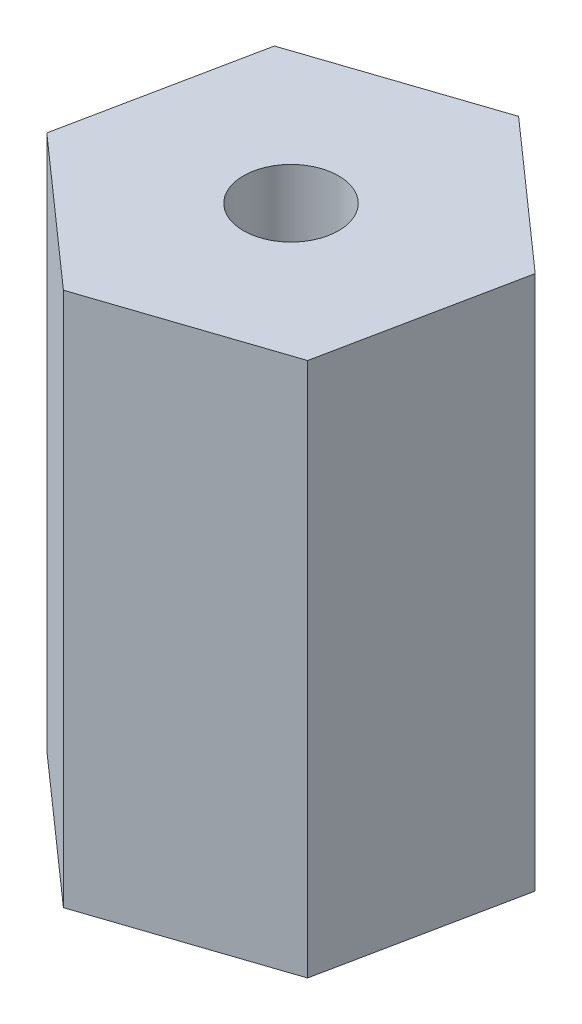
ISO-10303-21;
HEADER;
FILE_DESCRIPTION(('STEP AP214'),'2;1');
FILE_NAME('part.step','',(''),(''),'','','');
FILE_SCHEMA(('AUTOMOTIVE_DESIGN { 1 0 10303 214 1 1 1 1 }'));
ENDSEC;
DATA;
#1=APPLICATION_CONTEXT('core data for automotive mechanical design processes');
#2=APPLICATION_PROTOCOL_DEFINITION('international standard','automotive_design',2000,#1);
#3=PRODUCT_CONTEXT('',#1,'mechanical');
#4=PRODUCT('Part','Part','',(#3));
#5=PRODUCT_RELATED_PRODUCT_CATEGORY('part','',(#4));
#6=PRODUCT_DEFINITION_FORMATION('','',#4);
#7=PRODUCT_DEFINITION_CONTEXT('part definition',#1,'design');
#8=PRODUCT_DEFINITION('design','',#6,#7);
#9=PRODUCT_DEFINITION_SHAPE('','',#8);
#10=(LENGTH_UNIT() NAMED_UNIT(*) SI_UNIT(.MILLI.,.METRE.));
#11=(NAMED_UNIT(*) PLANE_ANGLE_UNIT() SI_UNIT($,.RADIAN.));
#12=(NAMED_UNIT(*) SI_UNIT($,.STERADIAN.) SOLID_ANGLE_UNIT());
#13=UNCERTAINTY_MEASURE_WITH_UNIT(LENGTH_MEASURE(1.E-05),#10,'distance_accuracy_value','');
#14=(GEOMETRIC_REPRESENTATION_CONTEXT(3) GLOBAL_UNCERTAINTY_ASSIGNED_CONTEXT((#13)) GLOBAL_UNIT_ASSIGNED_CONTEXT((#10,
#11,#12)) REPRESENTATION_CONTEXT('',''));
#15=CARTESIAN_POINT('',(0.,0.,0.));
#16=DIRECTION('',(0.,0.,1.));
#17=DIRECTION('',(1.,0.,0.));
#18=AXIS2_PLACEMENT_3D('',#15,#16,#17);
#19=CARTESIAN_POINT('',(-0.914726857565936,12.7,4.49049850900553));
#20=DIRECTION('',(-0.317076598186586,0.,-0.948399931928731));
#21=DIRECTION('',(-0.948399931928732,0.,0.317076598186586));
#22=AXIS2_PLACEMENT_3D('',#19,#20,#21);
#23=PLANE('',#22);
#24=DIRECTION('',(0.948399931928732,0.,-0.317076598186586));
#25=VECTOR('',#24,1.);
#26=CARTESIAN_POINT('',(-0.914726857565936,0.,4.49049850900553));
#27=LINE('',#26,#25);
#28=CARTESIAN_POINT('',(-0.914726857565936,0.,4.49049850900553));
#29=VERTEX_POINT('',#28);
#30=CARTESIAN_POINT('',(3.43152235567196,0.,3.03742595067878));
#31=VERTEX_POINT('',#30);
#32=EDGE_CURVE('E122',#29,#31,#27,.T.);
#33=ORIENTED_EDGE('',*,*,#32,.T.);
#34=DIRECTION('',(0.,-1.,0.));
#35=VECTOR('',#34,1.);
#36=CARTESIAN_POINT('',(3.43152235567196,12.7,3.03742595067878));
#37=LINE('',#36,#35);
#38=CARTESIAN_POINT('',(3.43152235567196,12.7,3.03742595067878));
#39=VERTEX_POINT('',#38);
#40=EDGE_CURVE('E11',#39,#31,#37,.T.);
#41=ORIENTED_EDGE('',*,*,#40,.F.);
#42=DIRECTION('',(0.948399931928732,0.,-0.317076598186586));
#43=VECTOR('',#42,1.);
#44=CARTESIAN_POINT('',(-0.914726857565936,12.7,4.49049850900553));
#45=LINE('',#44,#43);
#46=CARTESIAN_POINT('',(-0.914726857565936,12.7,4.49049850900553));
#47=VERTEX_POINT('',#46);
#48=EDGE_CURVE('E133',#47,#39,#45,.T.);
#49=ORIENTED_EDGE('',*,*,#48,.F.);
#50=DIRECTION('',(0.,-1.,0.));
#51=VECTOR('',#50,1.);
#52=CARTESIAN_POINT('',(-0.914726857565936,12.7,4.49049850900553));
#53=LINE('',#52,#51);
#54=EDGE_CURVE('E118',#47,#29,#53,.T.);
#55=ORIENTED_EDGE('',*,*,#54,.T.);
#56=EDGE_LOOP('',(#33,#41,#49,#55));
#57=FACE_BOUND('',#56,.T.);
#58=ADVANCED_FACE('F35',(#57),#23,.F.);
#59=CARTESIAN_POINT('',(3.43152235567196,12.7,3.03742595067878));
#60=DIRECTION('',(-0.979876733091007,0.,-0.199603576989231));
#61=DIRECTION('',(-0.199603576989231,0.,0.979876733091007));
#62=AXIS2_PLACEMENT_3D('',#59,#60,#61);
#63=PLANE('',#62);
#64=DIRECTION('',(0.199603576989231,0.,-0.979876733091007));
#65=VECTOR('',#64,1.);
#66=CARTESIAN_POINT('',(3.43152235567196,0.,3.03742595067878));
#67=LINE('',#66,#65);
#68=CARTESIAN_POINT('',(4.3462492132379,0.,-1.45307255832675));
#69=VERTEX_POINT('',#68);
#70=EDGE_CURVE('E125',#31,#69,#67,.T.);
#71=ORIENTED_EDGE('',*,*,#70,.T.);
#72=DIRECTION('',(0.,-1.,0.));
#73=VECTOR('',#72,1.);
#74=CARTESIAN_POINT('',(4.3462492132379,12.7,-1.45307255832675));
#75=LINE('',#74,#73);
#76=CARTESIAN_POINT('',(4.3462492132379,12.7,-1.45307255832675));
#77=VERTEX_POINT('',#76);
#78=EDGE_CURVE('E43',#77,#69,#75,.T.);
#79=ORIENTED_EDGE('',*,*,#78,.F.);
#80=DIRECTION('',(0.199603576989231,0.,-0.979876733091007));
#81=VECTOR('',#80,1.);
#82=CARTESIAN_POINT('',(3.43152235567196,12.7,3.03742595067878));
#83=LINE('',#82,#81);
#84=EDGE_CURVE('E89',#39,#77,#83,.T.);
#85=ORIENTED_EDGE('',*,*,#84,.F.);
#86=ORIENTED_EDGE('',*,*,#40,.T.);
#87=EDGE_LOOP('',(#71,#79,#85,#86));
#88=FACE_BOUND('',#87,.T.);
#89=ADVANCED_FACE('F158',(#88),#63,.F.);
#90=CARTESIAN_POINT('',(4.3462492132379,12.7,-1.45307255832675));
#91=DIRECTION('',(-0.662800134904421,0.,0.7487963549395));
#92=DIRECTION('',(0.7487963549395,0.,0.662800134904421));
#93=AXIS2_PLACEMENT_3D('',#90,#91,#92);
#94=PLANE('',#93);
#95=DIRECTION('',(-0.7487963549395,0.,-0.662800134904421));
#96=VECTOR('',#95,1.);
#97=CARTESIAN_POINT('',(4.3462492132379,0.,-1.45307255832675));
#98=LINE('',#97,#96);
#99=CARTESIAN_POINT('',(0.914726857565939,0.,-4.49049850900553));
#100=VERTEX_POINT('',#99);
#101=EDGE_CURVE('E128',#69,#100,#98,.T.);
#102=ORIENTED_EDGE('',*,*,#101,.T.);
#103=DIRECTION('',(0.,-1.,0.));
#104=VECTOR('',#103,1.);
#105=CARTESIAN_POINT('',(0.914726857565939,12.7,-4.49049850900553));
#106=LINE('',#105,#104);
#107=CARTESIAN_POINT('',(0.914726857565939,12.7,-4.49049850900553));
#108=VERTEX_POINT('',#107);
#109=EDGE_CURVE('E113',#108,#100,#106,.T.);
#110=ORIENTED_EDGE('',*,*,#109,.F.);
#111=DIRECTION('',(-0.7487963549395,0.,-0.662800134904421));
#112=VECTOR('',#111,1.);
#113=CARTESIAN_POINT('',(4.3462492132379,12.7,-1.45307255832675));
#114=LINE('',#113,#112);
#115=EDGE_CURVE('E104',#77,#108,#114,.T.);
#116=ORIENTED_EDGE('',*,*,#115,.F.);
#117=ORIENTED_EDGE('',*,*,#78,.T.);
#118=EDGE_LOOP('',(#102,#110,#116,#117));
#119=FACE_BOUND('',#118,.T.);
#120=ADVANCED_FACE('F139',(#119),#94,.F.);
#121=CARTESIAN_POINT('',(0.914726857565939,12.7,-4.49049850900553));
#122=DIRECTION('',(0.317076598186586,0.,0.948399931928732));
#123=DIRECTION('',(0.948399931928732,0.,-0.317076598186586));
#124=AXIS2_PLACEMENT_3D('',#121,#122,#123);
#125=PLANE('',#124);
#126=DIRECTION('',(-0.948399931928731,0.,0.317076598186586));
#127=VECTOR('',#126,1.);
#128=CARTESIAN_POINT('',(0.914726857565939,0.,-4.49049850900553));
#129=LINE('',#128,#127);
#130=CARTESIAN_POINT('',(-3.43152235567196,0.,-3.03742595067878));
#131=VERTEX_POINT('',#130);
#132=EDGE_CURVE('E112',#100,#131,#129,.T.);
#133=ORIENTED_EDGE('',*,*,#132,.T.);
#134=DIRECTION('',(0.,-1.,0.));
#135=VECTOR('',#134,1.);
#136=CARTESIAN_POINT('',(-3.43152235567196,12.7,-3.03742595067878));
#137=LINE('',#136,#135);
#138=CARTESIAN_POINT('',(-3.43152235567196,12.7,-3.03742595067878));
#139=VERTEX_POINT('',#138);
#140=EDGE_CURVE('E109',#139,#131,#137,.T.);
#141=ORIENTED_EDGE('',*,*,#140,.F.);
#142=DIRECTION('',(-0.948399931928731,0.,0.317076598186586));
#143=VECTOR('',#142,1.);
#144=CARTESIAN_POINT('',(0.914726857565939,12.7,-4.49049850900553));
#145=LINE('',#144,#143);
#146=EDGE_CURVE('E98',#108,#139,#145,.T.);
#147=ORIENTED_EDGE('',*,*,#146,.F.);
#148=ORIENTED_EDGE('',*,*,#109,.T.);
#149=EDGE_LOOP('',(#133,#141,#147,#148));
#150=FACE_BOUND('',#149,.T.);
#151=ADVANCED_FACE('F110',(#150),#125,.F.);
#152=CARTESIAN_POINT('',(-3.43152235567196,12.7,-3.03742595067878));
#153=DIRECTION('',(0.979876733091007,0.,0.199603576989231));
#154=DIRECTION('',(0.199603576989231,0.,-0.979876733091007));
#155=AXIS2_PLACEMENT_3D('',#152,#153,#154);
#156=PLANE('',#155);
#157=DIRECTION('',(-0.199603576989231,0.,0.979876733091007));
#158=VECTOR('',#157,1.);
#159=CARTESIAN_POINT('',(-3.43152235567196,0.,-3.03742595067878));
#160=LINE('',#159,#158);
#161=CARTESIAN_POINT('',(-4.3462492132379,0.,1.45307255832675));
#162=VERTEX_POINT('',#161);
#163=EDGE_CURVE('E75',#131,#162,#160,.T.);
#164=ORIENTED_EDGE('',*,*,#163,.T.);
#165=DIRECTION('',(0.,-1.,0.));
#166=VECTOR('',#165,1.);
#167=CARTESIAN_POINT('',(-4.3462492132379,12.7,1.45307255832675));
#168=LINE('',#167,#166);
#169=CARTESIAN_POINT('',(-4.3462492132379,12.7,1.45307255832675));
#170=VERTEX_POINT('',#169);
#171=EDGE_CURVE('E114',#170,#162,#168,.T.);
#172=ORIENTED_EDGE('',*,*,#171,.F.);
#173=DIRECTION('',(-0.199603576989231,0.,0.979876733091007));
#174=VECTOR('',#173,1.);
#175=CARTESIAN_POINT('',(-3.43152235567196,12.7,-3.03742595067878));
#176=LINE('',#175,#174);
#177=EDGE_CURVE('E102',#139,#170,#176,.T.);
#178=ORIENTED_EDGE('',*,*,#177,.F.);
#179=ORIENTED_EDGE('',*,*,#140,.T.);
#180=EDGE_LOOP('',(#164,#172,#178,#179));
#181=FACE_BOUND('',#180,.T.);
#182=ADVANCED_FACE('F116',(#181),#156,.F.);
#183=CARTESIAN_POINT('',(-4.3462492132379,12.7,1.45307255832675));
#184=DIRECTION('',(0.662800134904421,0.,-0.7487963549395));
#185=DIRECTION('',(-0.7487963549395,0.,-0.662800134904421));
#186=AXIS2_PLACEMENT_3D('',#183,#184,#185);
#187=PLANE('',#186);
#188=DIRECTION('',(0.7487963549395,0.,0.662800134904421));
#189=VECTOR('',#188,1.);
#190=CARTESIAN_POINT('',(-4.3462492132379,0.,1.45307255832675));
#191=LINE('',#190,#189);
#192=EDGE_CURVE('E81',#162,#29,#191,.T.);
#193=ORIENTED_EDGE('',*,*,#192,.T.);
#194=ORIENTED_EDGE('',*,*,#54,.F.);
#195=DIRECTION('',(0.7487963549395,0.,0.662800134904421));
#196=VECTOR('',#195,1.);
#197=CARTESIAN_POINT('',(-4.3462492132379,12.7,1.45307255832675));
#198=LINE('',#197,#196);
#199=EDGE_CURVE('E51',#170,#47,#198,.T.);
#200=ORIENTED_EDGE('',*,*,#199,.F.);
#201=ORIENTED_EDGE('',*,*,#171,.T.);
#202=EDGE_LOOP('',(#193,#194,#200,#201));
#203=FACE_BOUND('',#202,.T.);
#204=ADVANCED_FACE('F146',(#203),#187,.F.);
#205=CARTESIAN_POINT('',(0.,12.7,0.));
#206=DIRECTION('',(0.,1.,0.));
#207=DIRECTION('',(0.,0.,1.));
#208=AXIS2_PLACEMENT_3D('',#205,#206,#207);
#209=PLANE('',#208);
#210=CARTESIAN_POINT('',(0.,12.7,0.));
#211=DIRECTION('',(0.,1.,0.));
#212=DIRECTION('',(0.,0.,1.));
#213=AXIS2_PLACEMENT_3D('',#210,#211,#212);
#214=CIRCLE('',#213,1.13029999999999);
#215=CARTESIAN_POINT('',(0.,12.7,1.13029999999999));
#216=VERTEX_POINT('',#215);
#217=EDGE_CURVE('E249',#216,#216,#214,.T.);
#218=ORIENTED_EDGE('',*,*,#217,.F.);
#219=EDGE_LOOP('',(#218));
#220=FACE_BOUND('',#219,.T.);
#221=ORIENTED_EDGE('',*,*,#48,.T.);
#222=ORIENTED_EDGE('',*,*,#84,.T.);
#223=ORIENTED_EDGE('',*,*,#115,.T.);
#224=ORIENTED_EDGE('',*,*,#146,.T.);
#225=ORIENTED_EDGE('',*,*,#177,.T.);
#226=ORIENTED_EDGE('',*,*,#199,.T.);
#227=EDGE_LOOP('',(#221,#222,#223,#224,#225,#226));
#228=FACE_BOUND('',#227,.T.);
#229=ADVANCED_FACE('F100',(#220,#228),#209,.T.);
#230=CARTESIAN_POINT('',(0.,0.,0.));
#231=DIRECTION('',(0.,1.,0.));
#232=DIRECTION('',(0.,0.,1.));
#233=AXIS2_PLACEMENT_3D('',#230,#231,#232);
#234=PLANE('',#233);
#235=CARTESIAN_POINT('',(0.,0.,0.));
#236=DIRECTION('',(0.,-1.,0.));
#237=DIRECTION('',(0.,0.,-1.));
#238=AXIS2_PLACEMENT_3D('',#235,#236,#237);
#239=CIRCLE('',#238,1.35255);
#240=CARTESIAN_POINT('',(0.,0.,-1.35255));
#241=VERTEX_POINT('',#240);
#242=EDGE_CURVE('E247',#241,#241,#239,.T.);
#243=ORIENTED_EDGE('',*,*,#242,.F.);
#244=EDGE_LOOP('',(#243));
#245=FACE_BOUND('',#244,.T.);
#246=ORIENTED_EDGE('',*,*,#32,.F.);
#247=ORIENTED_EDGE('',*,*,#192,.F.);
#248=ORIENTED_EDGE('',*,*,#163,.F.);
#249=ORIENTED_EDGE('',*,*,#132,.F.);
#250=ORIENTED_EDGE('',*,*,#101,.F.);
#251=ORIENTED_EDGE('',*,*,#70,.F.);
#252=EDGE_LOOP('',(#246,#247,#248,#249,#250,#251));
#253=FACE_BOUND('',#252,.T.);
#254=ADVANCED_FACE('F142',(#245,#253),#234,.F.);
#255=CARTESIAN_POINT('',(0.,9.128125,0.));
#256=DIRECTION('',(0.,1.,0.));
#257=DIRECTION('',(0.,0.,1.));
#258=AXIS2_PLACEMENT_3D('',#255,#256,#257);
#259=CONICAL_SURFACE('',#258,1.1303,1.02974425867665);
#260=CARTESIAN_POINT('',(0.,8.44897224231315,0.));
#261=VERTEX_POINT('',#260);
#262=VERTEX_LOOP('',#261);
#263=FACE_BOUND('',#262,.T.);
#264=CARTESIAN_POINT('',(0.,9.128125,0.));
#265=DIRECTION('',(0.,1.,0.));
#266=DIRECTION('',(0.,0.,1.));
#267=AXIS2_PLACEMENT_3D('',#264,#265,#266);
#268=CIRCLE('',#267,1.1303);
#269=CARTESIAN_POINT('',(0.,9.128125,1.1303));
#270=VERTEX_POINT('',#269);
#271=EDGE_CURVE('E126',#270,#270,#268,.T.);
#272=ORIENTED_EDGE('',*,*,#271,.T.);
#273=EDGE_LOOP('',(#272));
#274=FACE_BOUND('',#273,.T.);
#275=ADVANCED_FACE('F193',(#263,#274),#259,.F.);
#276=CARTESIAN_POINT('',(0.,12.7,0.));
#277=DIRECTION('',(0.,1.,0.));
#278=DIRECTION('',(0.,0.,1.));
#279=AXIS2_PLACEMENT_3D('',#276,#277,#278);
#280=CYLINDRICAL_SURFACE('',#279,1.13029999999999);
#281=ORIENTED_EDGE('',*,*,#271,.F.);
#282=EDGE_LOOP('',(#281));
#283=FACE_BOUND('',#282,.T.);
#284=ORIENTED_EDGE('',*,*,#217,.T.);
#285=EDGE_LOOP('',(#284));
#286=FACE_BOUND('',#285,.T.);
#287=ADVANCED_FACE('F198',(#283,#286),#280,.F.);
#288=CARTESIAN_POINT('',(0.,3.556,0.));
#289=DIRECTION('',(0.,-1.,0.));
#290=DIRECTION('',(0.,0.,-1.));
#291=AXIS2_PLACEMENT_3D('',#288,#289,#290);
#292=CONICAL_SURFACE('',#291,1.35255,1.02974425867665);
#293=CARTESIAN_POINT('',(0.,4.36869403026572,0.));
#294=VERTEX_POINT('',#293);
#295=VERTEX_LOOP('',#294);
#296=FACE_BOUND('',#295,.T.);
#297=CARTESIAN_POINT('',(0.,3.556,0.));
#298=DIRECTION('',(0.,-1.,0.));
#299=DIRECTION('',(0.,0.,-1.));
#300=AXIS2_PLACEMENT_3D('',#297,#298,#299);
#301=CIRCLE('',#300,1.35255);
#302=CARTESIAN_POINT('',(0.,3.556,-1.35255));
#303=VERTEX_POINT('',#302);
#304=EDGE_CURVE('E244',#303,#303,#301,.T.);
#305=ORIENTED_EDGE('',*,*,#304,.T.);
#306=EDGE_LOOP('',(#305));
#307=FACE_BOUND('',#306,.T.);
#308=ADVANCED_FACE('F209',(#296,#307),#292,.F.);
#309=CARTESIAN_POINT('',(0.,0.,0.));
#310=DIRECTION('',(0.,-1.,0.));
#311=DIRECTION('',(0.,0.,-1.));
#312=AXIS2_PLACEMENT_3D('',#309,#310,#311);
#313=CYLINDRICAL_SURFACE('',#312,1.35255);
#314=ORIENTED_EDGE('',*,*,#304,.F.);
#315=EDGE_LOOP('',(#314));
#316=FACE_BOUND('',#315,.T.);
#317=ORIENTED_EDGE('',*,*,#242,.T.);
#318=EDGE_LOOP('',(#317));
#319=FACE_BOUND('',#318,.T.);
#320=ADVANCED_FACE('F226',(#316,#319),#313,.F.);
#321=CLOSED_SHELL('',(#58,#89,#120,#151,#182,#204,#229,#254,#275,#287,#308,#320));
#322=MANIFOLD_SOLID_BREP('B2',#321);
#323=ADVANCED_BREP_SHAPE_REPRESENTATION('',(#18,#322),#14);
#324=SHAPE_DEFINITION_REPRESENTATION(#9,#323);
ENDSEC;
END-ISO-10303-21;
